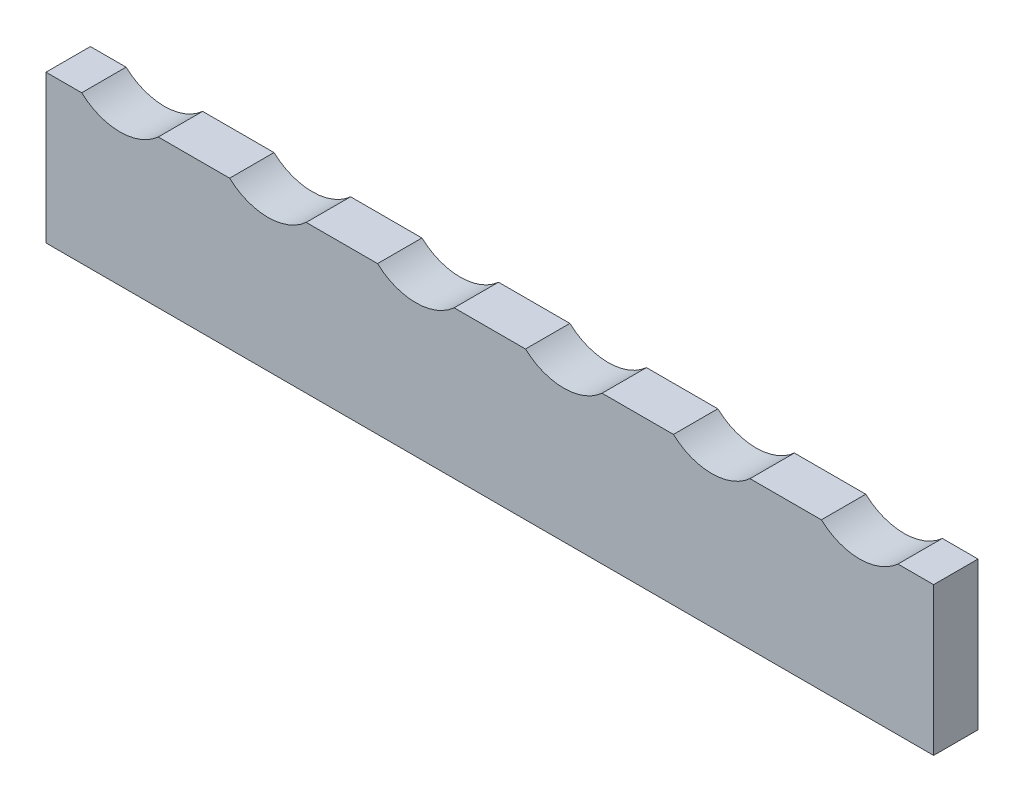
ISO-10303-21;
HEADER;
FILE_DESCRIPTION(('STEP AP214'),'2;1');
FILE_NAME('part.step','',(''),(''),'','','');
FILE_SCHEMA(('AUTOMOTIVE_DESIGN { 1 0 10303 214 1 1 1 1 }'));
ENDSEC;
DATA;
#1=APPLICATION_CONTEXT('core data for automotive mechanical design processes');
#2=APPLICATION_PROTOCOL_DEFINITION('international standard','automotive_design',2000,#1);
#3=PRODUCT_CONTEXT('',#1,'mechanical');
#4=PRODUCT('Part','Part','',(#3));
#5=PRODUCT_RELATED_PRODUCT_CATEGORY('part','',(#4));
#6=PRODUCT_DEFINITION_FORMATION('','',#4);
#7=PRODUCT_DEFINITION_CONTEXT('part definition',#1,'design');
#8=PRODUCT_DEFINITION('design','',#6,#7);
#9=PRODUCT_DEFINITION_SHAPE('','',#8);
#10=(LENGTH_UNIT() NAMED_UNIT(*) SI_UNIT(.MILLI.,.METRE.));
#11=(NAMED_UNIT(*) PLANE_ANGLE_UNIT() SI_UNIT($,.RADIAN.));
#12=(NAMED_UNIT(*) SI_UNIT($,.STERADIAN.) SOLID_ANGLE_UNIT());
#13=UNCERTAINTY_MEASURE_WITH_UNIT(LENGTH_MEASURE(1.E-05),#10,'distance_accuracy_value','');
#14=(GEOMETRIC_REPRESENTATION_CONTEXT(3) GLOBAL_UNCERTAINTY_ASSIGNED_CONTEXT((#13)) GLOBAL_UNIT_ASSIGNED_CONTEXT((#10,
#11,#12)) REPRESENTATION_CONTEXT('',''));
#15=CARTESIAN_POINT('',(0.,0.,0.));
#16=DIRECTION('',(0.,0.,1.));
#17=DIRECTION('',(1.,0.,0.));
#18=AXIS2_PLACEMENT_3D('',#15,#16,#17);
#19=CARTESIAN_POINT('',(600.,100.,30.));
#20=DIRECTION('',(0.,-1.,0.));
#21=DIRECTION('',(1.,0.,0.));
#22=AXIS2_PLACEMENT_3D('',#19,#20,#21);
#23=PLANE('',#22);
#24=DIRECTION('',(-1.,0.,0.));
#25=VECTOR('',#24,1.);
#26=CARTESIAN_POINT('',(600.,100.,0.));
#27=LINE('',#26,#25);
#28=CARTESIAN_POINT('',(224.11564178891,100.,0.));
#29=VERTEX_POINT('',#28);
#30=CARTESIAN_POINT('',(175.88435821109,100.,0.));
#31=VERTEX_POINT('',#30);
#32=EDGE_CURVE('E188',#29,#31,#27,.T.);
#33=ORIENTED_EDGE('',*,*,#32,.T.);
#34=DIRECTION('',(0.,0.,1.));
#35=VECTOR('',#34,1.);
#36=CARTESIAN_POINT('',(175.88435821109,100.,0.));
#37=LINE('',#36,#35);
#38=CARTESIAN_POINT('',(175.88435821109,100.,30.));
#39=VERTEX_POINT('',#38);
#40=EDGE_CURVE('E48',#31,#39,#37,.T.);
#41=ORIENTED_EDGE('',*,*,#40,.T.);
#42=DIRECTION('',(-1.,0.,0.));
#43=VECTOR('',#42,1.);
#44=CARTESIAN_POINT('',(600.,100.,30.));
#45=LINE('',#44,#43);
#46=CARTESIAN_POINT('',(224.11564178891,100.,30.));
#47=VERTEX_POINT('',#46);
#48=EDGE_CURVE('E275',#47,#39,#45,.T.);
#49=ORIENTED_EDGE('',*,*,#48,.F.);
#50=DIRECTION('',(0.,0.,1.));
#51=VECTOR('',#50,1.);
#52=CARTESIAN_POINT('',(224.11564178891,100.,0.));
#53=LINE('',#52,#51);
#54=EDGE_CURVE('E230',#47,#29,#53,.F.);
#55=ORIENTED_EDGE('',*,*,#54,.T.);
#56=EDGE_LOOP('',(#33,#41,#49,#55));
#57=FACE_BOUND('',#56,.T.);
#58=ADVANCED_FACE('F33',(#57),#23,.F.);
#59=CARTESIAN_POINT('',(324.115641788911,100.,0.));
#60=VERTEX_POINT('',#59);
#61=CARTESIAN_POINT('',(275.88435821109,100.,0.));
#62=VERTEX_POINT('',#61);
#63=EDGE_CURVE('E179',#60,#62,#27,.T.);
#64=ORIENTED_EDGE('',*,*,#63,.T.);
#65=DIRECTION('',(0.,0.,1.));
#66=VECTOR('',#65,1.);
#67=CARTESIAN_POINT('',(275.88435821109,100.,0.));
#68=LINE('',#67,#66);
#69=CARTESIAN_POINT('',(275.88435821109,100.,30.));
#70=VERTEX_POINT('',#69);
#71=EDGE_CURVE('E56',#62,#70,#68,.T.);
#72=ORIENTED_EDGE('',*,*,#71,.T.);
#73=CARTESIAN_POINT('',(324.115641788911,100.,30.));
#74=VERTEX_POINT('',#73);
#75=EDGE_CURVE('E277',#74,#70,#45,.T.);
#76=ORIENTED_EDGE('',*,*,#75,.F.);
#77=DIRECTION('',(0.,0.,1.));
#78=VECTOR('',#77,1.);
#79=CARTESIAN_POINT('',(324.115641788911,100.,0.));
#80=LINE('',#79,#78);
#81=EDGE_CURVE('E238',#74,#60,#80,.F.);
#82=ORIENTED_EDGE('',*,*,#81,.T.);
#83=EDGE_LOOP('',(#64,#72,#76,#82));
#84=FACE_BOUND('',#83,.T.);
#85=ADVANCED_FACE('F267',(#84),#23,.F.);
#86=CARTESIAN_POINT('',(424.11564178891,100.,0.));
#87=VERTEX_POINT('',#86);
#88=CARTESIAN_POINT('',(375.88435821109,100.,0.));
#89=VERTEX_POINT('',#88);
#90=EDGE_CURVE('E173',#87,#89,#27,.T.);
#91=ORIENTED_EDGE('',*,*,#90,.T.);
#92=DIRECTION('',(0.,0.,1.));
#93=VECTOR('',#92,1.);
#94=CARTESIAN_POINT('',(375.88435821109,100.,0.));
#95=LINE('',#94,#93);
#96=CARTESIAN_POINT('',(375.88435821109,100.,30.));
#97=VERTEX_POINT('',#96);
#98=EDGE_CURVE('E235',#89,#97,#95,.T.);
#99=ORIENTED_EDGE('',*,*,#98,.T.);
#100=CARTESIAN_POINT('',(424.11564178891,100.,30.));
#101=VERTEX_POINT('',#100);
#102=EDGE_CURVE('E278',#101,#97,#45,.T.);
#103=ORIENTED_EDGE('',*,*,#102,.F.);
#104=DIRECTION('',(0.,0.,1.));
#105=VECTOR('',#104,1.);
#106=CARTESIAN_POINT('',(424.11564178891,100.,0.));
#107=LINE('',#106,#105);
#108=EDGE_CURVE('E245',#101,#87,#107,.F.);
#109=ORIENTED_EDGE('',*,*,#108,.T.);
#110=EDGE_LOOP('',(#91,#99,#103,#109));
#111=FACE_BOUND('',#110,.T.);
#112=ADVANCED_FACE('F286',(#111),#23,.F.);
#113=CARTESIAN_POINT('',(524.115641788911,100.,0.));
#114=VERTEX_POINT('',#113);
#115=CARTESIAN_POINT('',(475.88435821109,100.,0.));
#116=VERTEX_POINT('',#115);
#117=EDGE_CURVE('E163',#114,#116,#27,.T.);
#118=ORIENTED_EDGE('',*,*,#117,.T.);
#119=DIRECTION('',(0.,0.,1.));
#120=VECTOR('',#119,1.);
#121=CARTESIAN_POINT('',(475.88435821109,100.,0.));
#122=LINE('',#121,#120);
#123=CARTESIAN_POINT('',(475.88435821109,100.,30.));
#124=VERTEX_POINT('',#123);
#125=EDGE_CURVE('E243',#116,#124,#122,.T.);
#126=ORIENTED_EDGE('',*,*,#125,.T.);
#127=CARTESIAN_POINT('',(524.115641788911,100.,30.));
#128=VERTEX_POINT('',#127);
#129=EDGE_CURVE('E165',#128,#124,#45,.T.);
#130=ORIENTED_EDGE('',*,*,#129,.F.);
#131=DIRECTION('',(0.,0.,1.));
#132=VECTOR('',#131,1.);
#133=CARTESIAN_POINT('',(524.115641788911,100.,0.));
#134=LINE('',#133,#132);
#135=EDGE_CURVE('E148',#128,#114,#134,.F.);
#136=ORIENTED_EDGE('',*,*,#135,.T.);
#137=EDGE_LOOP('',(#118,#126,#130,#136));
#138=FACE_BOUND('',#137,.T.);
#139=ADVANCED_FACE('F161',(#138),#23,.F.);
#140=CARTESIAN_POINT('',(600.,100.,0.));
#141=VERTEX_POINT('',#140);
#142=CARTESIAN_POINT('',(575.88435821109,100.,0.));
#143=VERTEX_POINT('',#142);
#144=EDGE_CURVE('E172',#141,#143,#27,.T.);
#145=ORIENTED_EDGE('',*,*,#144,.T.);
#146=DIRECTION('',(0.,0.,1.));
#147=VECTOR('',#146,1.);
#148=CARTESIAN_POINT('',(575.88435821109,100.,0.));
#149=LINE('',#148,#147);
#150=CARTESIAN_POINT('',(575.88435821109,100.,30.));
#151=VERTEX_POINT('',#150);
#152=EDGE_CURVE('E151',#143,#151,#149,.T.);
#153=ORIENTED_EDGE('',*,*,#152,.T.);
#154=CARTESIAN_POINT('',(600.,100.,30.));
#155=VERTEX_POINT('',#154);
#156=EDGE_CURVE('E201',#155,#151,#45,.T.);
#157=ORIENTED_EDGE('',*,*,#156,.F.);
#158=DIRECTION('',(0.,0.,-1.));
#159=VECTOR('',#158,1.);
#160=CARTESIAN_POINT('',(600.,100.,30.));
#161=LINE('',#160,#159);
#162=EDGE_CURVE('E332',#155,#141,#161,.T.);
#163=ORIENTED_EDGE('',*,*,#162,.T.);
#164=EDGE_LOOP('',(#145,#153,#157,#163));
#165=FACE_BOUND('',#164,.T.);
#166=ADVANCED_FACE('F318',(#165),#23,.F.);
#167=CARTESIAN_POINT('',(124.115641788911,100.,30.));
#168=VERTEX_POINT('',#167);
#169=CARTESIAN_POINT('',(75.8843582110895,100.,30.));
#170=VERTEX_POINT('',#169);
#171=EDGE_CURVE('E205',#168,#170,#45,.T.);
#172=ORIENTED_EDGE('',*,*,#171,.F.);
#173=DIRECTION('',(0.,0.,1.));
#174=VECTOR('',#173,1.);
#175=CARTESIAN_POINT('',(124.115641788911,100.,0.));
#176=LINE('',#175,#174);
#177=CARTESIAN_POINT('',(124.115641788911,100.,0.));
#178=VERTEX_POINT('',#177);
#179=EDGE_CURVE('E224',#168,#178,#176,.F.);
#180=ORIENTED_EDGE('',*,*,#179,.T.);
#181=CARTESIAN_POINT('',(75.8843582110895,100.,0.));
#182=VERTEX_POINT('',#181);
#183=EDGE_CURVE('E177',#178,#182,#27,.T.);
#184=ORIENTED_EDGE('',*,*,#183,.T.);
#185=DIRECTION('',(0.,0.,1.));
#186=VECTOR('',#185,1.);
#187=CARTESIAN_POINT('',(75.8843582110895,100.,0.));
#188=LINE('',#187,#186);
#189=EDGE_CURVE('E200',#182,#170,#188,.T.);
#190=ORIENTED_EDGE('',*,*,#189,.T.);
#191=EDGE_LOOP('',(#172,#180,#184,#190));
#192=FACE_BOUND('',#191,.T.);
#193=ADVANCED_FACE('F310',(#192),#23,.F.);
#194=CARTESIAN_POINT('',(0.,100.,30.));
#195=DIRECTION('',(1.,0.,0.));
#196=DIRECTION('',(0.,0.,-1.));
#197=AXIS2_PLACEMENT_3D('',#194,#195,#196);
#198=PLANE('',#197);
#199=DIRECTION('',(0.,-1.,0.));
#200=VECTOR('',#199,1.);
#201=CARTESIAN_POINT('',(0.,100.,0.));
#202=LINE('',#201,#200);
#203=CARTESIAN_POINT('',(0.,100.,0.));
#204=VERTEX_POINT('',#203);
#205=CARTESIAN_POINT('',(0.,0.,0.));
#206=VERTEX_POINT('',#205);
#207=EDGE_CURVE('E195',#204,#206,#202,.T.);
#208=ORIENTED_EDGE('',*,*,#207,.T.);
#209=DIRECTION('',(0.,0.,-1.));
#210=VECTOR('',#209,1.);
#211=CARTESIAN_POINT('',(0.,0.,30.));
#212=LINE('',#211,#210);
#213=CARTESIAN_POINT('',(0.,0.,30.));
#214=VERTEX_POINT('',#213);
#215=EDGE_CURVE('E11',#214,#206,#212,.T.);
#216=ORIENTED_EDGE('',*,*,#215,.F.);
#217=DIRECTION('',(0.,-1.,0.));
#218=VECTOR('',#217,1.);
#219=CARTESIAN_POINT('',(0.,100.,30.));
#220=LINE('',#219,#218);
#221=CARTESIAN_POINT('',(0.,100.,30.));
#222=VERTEX_POINT('',#221);
#223=EDGE_CURVE('E176',#222,#214,#220,.T.);
#224=ORIENTED_EDGE('',*,*,#223,.F.);
#225=DIRECTION('',(0.,0.,-1.));
#226=VECTOR('',#225,1.);
#227=CARTESIAN_POINT('',(0.,100.,30.));
#228=LINE('',#227,#226);
#229=EDGE_CURVE('E204',#222,#204,#228,.T.);
#230=ORIENTED_EDGE('',*,*,#229,.T.);
#231=EDGE_LOOP('',(#208,#216,#224,#230));
#232=FACE_BOUND('',#231,.T.);
#233=ADVANCED_FACE('F35',(#232),#198,.F.);
#234=CARTESIAN_POINT('',(0.,0.,30.));
#235=DIRECTION('',(0.,1.,0.));
#236=DIRECTION('',(0.,0.,1.));
#237=AXIS2_PLACEMENT_3D('',#234,#235,#236);
#238=PLANE('',#237);
#239=DIRECTION('',(1.,0.,0.));
#240=VECTOR('',#239,1.);
#241=CARTESIAN_POINT('',(0.,0.,0.));
#242=LINE('',#241,#240);
#243=CARTESIAN_POINT('',(600.,0.,0.));
#244=VERTEX_POINT('',#243);
#245=EDGE_CURVE('E189',#206,#244,#242,.T.);
#246=ORIENTED_EDGE('',*,*,#245,.T.);
#247=DIRECTION('',(0.,0.,-1.));
#248=VECTOR('',#247,1.);
#249=CARTESIAN_POINT('',(600.,0.,30.));
#250=LINE('',#249,#248);
#251=CARTESIAN_POINT('',(600.,0.,30.));
#252=VERTEX_POINT('',#251);
#253=EDGE_CURVE('E41',#252,#244,#250,.T.);
#254=ORIENTED_EDGE('',*,*,#253,.F.);
#255=DIRECTION('',(1.,0.,0.));
#256=VECTOR('',#255,1.);
#257=CARTESIAN_POINT('',(0.,0.,30.));
#258=LINE('',#257,#256);
#259=EDGE_CURVE('E209',#214,#252,#258,.T.);
#260=ORIENTED_EDGE('',*,*,#259,.F.);
#261=ORIENTED_EDGE('',*,*,#215,.T.);
#262=EDGE_LOOP('',(#246,#254,#260,#261));
#263=FACE_BOUND('',#262,.T.);
#264=ADVANCED_FACE('F316',(#263),#238,.F.);
#265=CARTESIAN_POINT('',(600.,0.,30.));
#266=DIRECTION('',(-1.,0.,0.));
#267=DIRECTION('',(0.,0.,1.));
#268=AXIS2_PLACEMENT_3D('',#265,#266,#267);
#269=PLANE('',#268);
#270=DIRECTION('',(0.,1.,0.));
#271=VECTOR('',#270,1.);
#272=CARTESIAN_POINT('',(600.,0.,0.));
#273=LINE('',#272,#271);
#274=EDGE_CURVE('E182',#244,#141,#273,.T.);
#275=ORIENTED_EDGE('',*,*,#274,.T.);
#276=ORIENTED_EDGE('',*,*,#162,.F.);
#277=DIRECTION('',(0.,1.,0.));
#278=VECTOR('',#277,1.);
#279=CARTESIAN_POINT('',(600.,0.,30.));
#280=LINE('',#279,#278);
#281=EDGE_CURVE('E207',#252,#155,#280,.T.);
#282=ORIENTED_EDGE('',*,*,#281,.F.);
#283=ORIENTED_EDGE('',*,*,#253,.T.);
#284=EDGE_LOOP('',(#275,#276,#282,#283));
#285=FACE_BOUND('',#284,.T.);
#286=ADVANCED_FACE('F309',(#285),#269,.F.);
#287=CARTESIAN_POINT('',(24.1156417889105,100.,30.));
#288=VERTEX_POINT('',#287);
#289=EDGE_CURVE('E206',#288,#222,#45,.T.);
#290=ORIENTED_EDGE('',*,*,#289,.F.);
#291=DIRECTION('',(0.,0.,1.));
#292=VECTOR('',#291,1.);
#293=CARTESIAN_POINT('',(24.1156417889105,100.,0.));
#294=LINE('',#293,#292);
#295=CARTESIAN_POINT('',(24.1156417889105,100.,0.));
#296=VERTEX_POINT('',#295);
#297=EDGE_CURVE('E215',#288,#296,#294,.F.);
#298=ORIENTED_EDGE('',*,*,#297,.T.);
#299=EDGE_CURVE('E175',#296,#204,#27,.T.);
#300=ORIENTED_EDGE('',*,*,#299,.T.);
#301=ORIENTED_EDGE('',*,*,#229,.F.);
#302=EDGE_LOOP('',(#290,#298,#300,#301));
#303=FACE_BOUND('',#302,.T.);
#304=ADVANCED_FACE('F302',(#303),#23,.F.);
#305=CARTESIAN_POINT('',(0.,0.,30.));
#306=DIRECTION('',(0.,0.,1.));
#307=DIRECTION('',(1.,0.,0.));
#308=AXIS2_PLACEMENT_3D('',#305,#306,#307);
#309=PLANE('',#308);
#310=CARTESIAN_POINT('',(150.,128.5,30.));
#311=DIRECTION('',(0.,0.,1.));
#312=DIRECTION('',(1.,0.,0.));
#313=AXIS2_PLACEMENT_3D('',#310,#311,#312);
#314=CIRCLE('',#313,38.5);
#315=EDGE_CURVE('E227',#168,#39,#314,.T.);
#316=ORIENTED_EDGE('',*,*,#315,.F.);
#317=ORIENTED_EDGE('',*,*,#171,.T.);
#318=CARTESIAN_POINT('',(50.,128.5,30.));
#319=DIRECTION('',(0.,0.,1.));
#320=DIRECTION('',(1.,0.,0.));
#321=AXIS2_PLACEMENT_3D('',#318,#319,#320);
#322=CIRCLE('',#321,38.5);
#323=EDGE_CURVE('E217',#288,#170,#322,.T.);
#324=ORIENTED_EDGE('',*,*,#323,.F.);
#325=ORIENTED_EDGE('',*,*,#289,.T.);
#326=ORIENTED_EDGE('',*,*,#223,.T.);
#327=ORIENTED_EDGE('',*,*,#259,.T.);
#328=ORIENTED_EDGE('',*,*,#281,.T.);
#329=ORIENTED_EDGE('',*,*,#156,.T.);
#330=CARTESIAN_POINT('',(550.,128.5,30.));
#331=DIRECTION('',(0.,0.,1.));
#332=DIRECTION('',(1.,0.,0.));
#333=AXIS2_PLACEMENT_3D('',#330,#331,#332);
#334=CIRCLE('',#333,38.5);
#335=EDGE_CURVE('E166',#128,#151,#334,.T.);
#336=ORIENTED_EDGE('',*,*,#335,.F.);
#337=ORIENTED_EDGE('',*,*,#129,.T.);
#338=CARTESIAN_POINT('',(450.,128.5,30.));
#339=DIRECTION('',(0.,0.,1.));
#340=DIRECTION('',(1.,0.,0.));
#341=AXIS2_PLACEMENT_3D('',#338,#339,#340);
#342=CIRCLE('',#341,38.5);
#343=EDGE_CURVE('E248',#101,#124,#342,.T.);
#344=ORIENTED_EDGE('',*,*,#343,.F.);
#345=ORIENTED_EDGE('',*,*,#102,.T.);
#346=CARTESIAN_POINT('',(350.,128.5,30.));
#347=DIRECTION('',(0.,0.,1.));
#348=DIRECTION('',(1.,0.,0.));
#349=AXIS2_PLACEMENT_3D('',#346,#347,#348);
#350=CIRCLE('',#349,38.5);
#351=EDGE_CURVE('E241',#74,#97,#350,.T.);
#352=ORIENTED_EDGE('',*,*,#351,.F.);
#353=ORIENTED_EDGE('',*,*,#75,.T.);
#354=CARTESIAN_POINT('',(250.,128.5,30.));
#355=DIRECTION('',(0.,0.,1.));
#356=DIRECTION('',(1.,0.,0.));
#357=AXIS2_PLACEMENT_3D('',#354,#355,#356);
#358=CIRCLE('',#357,38.5);
#359=EDGE_CURVE('E233',#47,#70,#358,.T.);
#360=ORIENTED_EDGE('',*,*,#359,.F.);
#361=ORIENTED_EDGE('',*,*,#48,.T.);
#362=EDGE_LOOP('',(#316,#317,#324,#325,#326,#327,#328,#329,#336,#337,#344,#345,#352,#353,#360,#361));
#363=FACE_BOUND('',#362,.T.);
#364=ADVANCED_FACE('F274',(#363),#309,.T.);
#365=CARTESIAN_POINT('',(0.,0.,0.));
#366=DIRECTION('',(0.,0.,1.));
#367=DIRECTION('',(1.,0.,0.));
#368=AXIS2_PLACEMENT_3D('',#365,#366,#367);
#369=PLANE('',#368);
#370=ORIENTED_EDGE('',*,*,#183,.F.);
#371=CARTESIAN_POINT('',(150.,128.5,0.));
#372=DIRECTION('',(0.,0.,1.));
#373=DIRECTION('',(1.,0.,0.));
#374=AXIS2_PLACEMENT_3D('',#371,#372,#373);
#375=CIRCLE('',#374,38.5);
#376=EDGE_CURVE('E251',#178,#31,#375,.T.);
#377=ORIENTED_EDGE('',*,*,#376,.T.);
#378=ORIENTED_EDGE('',*,*,#32,.F.);
#379=CARTESIAN_POINT('',(250.,128.5,0.));
#380=DIRECTION('',(0.,0.,1.));
#381=DIRECTION('',(1.,0.,0.));
#382=AXIS2_PLACEMENT_3D('',#379,#380,#381);
#383=CIRCLE('',#382,38.5);
#384=EDGE_CURVE('E257',#29,#62,#383,.T.);
#385=ORIENTED_EDGE('',*,*,#384,.T.);
#386=ORIENTED_EDGE('',*,*,#63,.F.);
#387=CARTESIAN_POINT('',(350.,128.5,0.));
#388=DIRECTION('',(0.,0.,1.));
#389=DIRECTION('',(1.,0.,0.));
#390=AXIS2_PLACEMENT_3D('',#387,#388,#389);
#391=CIRCLE('',#390,38.5);
#392=EDGE_CURVE('E254',#60,#89,#391,.T.);
#393=ORIENTED_EDGE('',*,*,#392,.T.);
#394=ORIENTED_EDGE('',*,*,#90,.F.);
#395=CARTESIAN_POINT('',(450.,128.5,0.));
#396=DIRECTION('',(0.,0.,1.));
#397=DIRECTION('',(1.,0.,0.));
#398=AXIS2_PLACEMENT_3D('',#395,#396,#397);
#399=CIRCLE('',#398,38.5);
#400=EDGE_CURVE('E156',#87,#116,#399,.T.);
#401=ORIENTED_EDGE('',*,*,#400,.T.);
#402=ORIENTED_EDGE('',*,*,#117,.F.);
#403=CARTESIAN_POINT('',(550.,128.5,0.));
#404=DIRECTION('',(0.,0.,1.));
#405=DIRECTION('',(1.,0.,0.));
#406=AXIS2_PLACEMENT_3D('',#403,#404,#405);
#407=CIRCLE('',#406,38.5);
#408=EDGE_CURVE('E145',#114,#143,#407,.T.);
#409=ORIENTED_EDGE('',*,*,#408,.T.);
#410=ORIENTED_EDGE('',*,*,#144,.F.);
#411=ORIENTED_EDGE('',*,*,#274,.F.);
#412=ORIENTED_EDGE('',*,*,#245,.F.);
#413=ORIENTED_EDGE('',*,*,#207,.F.);
#414=ORIENTED_EDGE('',*,*,#299,.F.);
#415=CARTESIAN_POINT('',(50.,128.5,0.));
#416=DIRECTION('',(0.,0.,1.));
#417=DIRECTION('',(1.,0.,0.));
#418=AXIS2_PLACEMENT_3D('',#415,#416,#417);
#419=CIRCLE('',#418,38.5);
#420=EDGE_CURVE('E220',#296,#182,#419,.T.);
#421=ORIENTED_EDGE('',*,*,#420,.T.);
#422=EDGE_LOOP('',(#370,#377,#378,#385,#386,#393,#394,#401,#402,#409,#410,#411,#412,#413,#414,#421));
#423=FACE_BOUND('',#422,.T.);
#424=ADVANCED_FACE('F170',(#423),#369,.F.);
#425=CARTESIAN_POINT('',(50.,128.5,0.));
#426=DIRECTION('',(0.,0.,1.));
#427=DIRECTION('',(1.,0.,0.));
#428=AXIS2_PLACEMENT_3D('',#425,#426,#427);
#429=CYLINDRICAL_SURFACE('',#428,38.5);
#430=ORIENTED_EDGE('',*,*,#420,.F.);
#431=ORIENTED_EDGE('',*,*,#297,.F.);
#432=ORIENTED_EDGE('',*,*,#323,.T.);
#433=ORIENTED_EDGE('',*,*,#189,.F.);
#434=EDGE_LOOP('',(#430,#431,#432,#433));
#435=FACE_BOUND('',#434,.T.);
#436=ADVANCED_FACE('F328',(#435),#429,.F.);
#437=CARTESIAN_POINT('',(550.,128.5,0.));
#438=DIRECTION('',(0.,0.,1.));
#439=DIRECTION('',(1.,0.,0.));
#440=AXIS2_PLACEMENT_3D('',#437,#438,#439);
#441=CYLINDRICAL_SURFACE('',#440,38.5);
#442=ORIENTED_EDGE('',*,*,#408,.F.);
#443=ORIENTED_EDGE('',*,*,#135,.F.);
#444=ORIENTED_EDGE('',*,*,#335,.T.);
#445=ORIENTED_EDGE('',*,*,#152,.F.);
#446=EDGE_LOOP('',(#442,#443,#444,#445));
#447=FACE_BOUND('',#446,.T.);
#448=ADVANCED_FACE('F147',(#447),#441,.F.);
#449=CARTESIAN_POINT('',(450.,128.5,0.));
#450=DIRECTION('',(0.,0.,1.));
#451=DIRECTION('',(1.,0.,0.));
#452=AXIS2_PLACEMENT_3D('',#449,#450,#451);
#453=CYLINDRICAL_SURFACE('',#452,38.5);
#454=ORIENTED_EDGE('',*,*,#400,.F.);
#455=ORIENTED_EDGE('',*,*,#108,.F.);
#456=ORIENTED_EDGE('',*,*,#343,.T.);
#457=ORIENTED_EDGE('',*,*,#125,.F.);
#458=EDGE_LOOP('',(#454,#455,#456,#457));
#459=FACE_BOUND('',#458,.T.);
#460=ADVANCED_FACE('F290',(#459),#453,.F.);
#461=CARTESIAN_POINT('',(350.,128.5,0.));
#462=DIRECTION('',(0.,0.,1.));
#463=DIRECTION('',(1.,0.,0.));
#464=AXIS2_PLACEMENT_3D('',#461,#462,#463);
#465=CYLINDRICAL_SURFACE('',#464,38.5);
#466=ORIENTED_EDGE('',*,*,#392,.F.);
#467=ORIENTED_EDGE('',*,*,#81,.F.);
#468=ORIENTED_EDGE('',*,*,#351,.T.);
#469=ORIENTED_EDGE('',*,*,#98,.F.);
#470=EDGE_LOOP('',(#466,#467,#468,#469));
#471=FACE_BOUND('',#470,.T.);
#472=ADVANCED_FACE('F288',(#471),#465,.F.);
#473=CARTESIAN_POINT('',(250.,128.5,0.));
#474=DIRECTION('',(0.,0.,1.));
#475=DIRECTION('',(1.,0.,0.));
#476=AXIS2_PLACEMENT_3D('',#473,#474,#475);
#477=CYLINDRICAL_SURFACE('',#476,38.5);
#478=ORIENTED_EDGE('',*,*,#384,.F.);
#479=ORIENTED_EDGE('',*,*,#54,.F.);
#480=ORIENTED_EDGE('',*,*,#359,.T.);
#481=ORIENTED_EDGE('',*,*,#71,.F.);
#482=EDGE_LOOP('',(#478,#479,#480,#481));
#483=FACE_BOUND('',#482,.T.);
#484=ADVANCED_FACE('F270',(#483),#477,.F.);
#485=CARTESIAN_POINT('',(150.,128.5,0.));
#486=DIRECTION('',(0.,0.,1.));
#487=DIRECTION('',(1.,0.,0.));
#488=AXIS2_PLACEMENT_3D('',#485,#486,#487);
#489=CYLINDRICAL_SURFACE('',#488,38.5);
#490=ORIENTED_EDGE('',*,*,#376,.F.);
#491=ORIENTED_EDGE('',*,*,#179,.F.);
#492=ORIENTED_EDGE('',*,*,#315,.T.);
#493=ORIENTED_EDGE('',*,*,#40,.F.);
#494=EDGE_LOOP('',(#490,#491,#492,#493));
#495=FACE_BOUND('',#494,.T.);
#496=ADVANCED_FACE('F296',(#495),#489,.F.);
#497=CLOSED_SHELL('',(#58,#85,#112,#139,#166,#193,#233,#264,#286,#304,#364,#424,#436,#448,#460,
#472,#484,#496));
#498=MANIFOLD_SOLID_BREP('B2',#497);
#499=ADVANCED_BREP_SHAPE_REPRESENTATION('',(#18,#498),#14);
#500=SHAPE_DEFINITION_REPRESENTATION(#9,#499);
ENDSEC;
END-ISO-10303-21;
